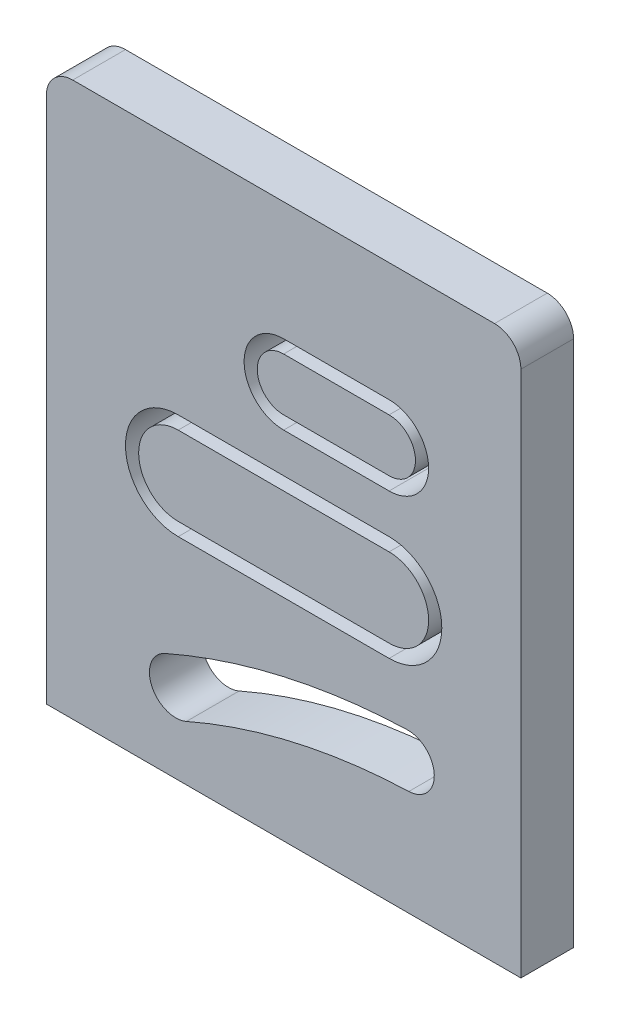
ISO-10303-21;
HEADER;
FILE_DESCRIPTION(('STEP AP214'),'2;1');
FILE_NAME('part.step','',(''),(''),'','','');
FILE_SCHEMA(('AUTOMOTIVE_DESIGN { 1 0 10303 214 1 1 1 1 }'));
ENDSEC;
DATA;
#1=APPLICATION_CONTEXT('core data for automotive mechanical design processes');
#2=APPLICATION_PROTOCOL_DEFINITION('international standard','automotive_design',2000,#1);
#3=PRODUCT_CONTEXT('',#1,'mechanical');
#4=PRODUCT('Part','Part','',(#3));
#5=PRODUCT_RELATED_PRODUCT_CATEGORY('part','',(#4));
#6=PRODUCT_DEFINITION_FORMATION('','',#4);
#7=PRODUCT_DEFINITION_CONTEXT('part definition',#1,'design');
#8=PRODUCT_DEFINITION('design','',#6,#7);
#9=PRODUCT_DEFINITION_SHAPE('','',#8);
#10=(LENGTH_UNIT() NAMED_UNIT(*) SI_UNIT(.MILLI.,.METRE.));
#11=(NAMED_UNIT(*) PLANE_ANGLE_UNIT() SI_UNIT($,.RADIAN.));
#12=(NAMED_UNIT(*) SI_UNIT($,.STERADIAN.) SOLID_ANGLE_UNIT());
#13=UNCERTAINTY_MEASURE_WITH_UNIT(LENGTH_MEASURE(1.E-05),#10,'distance_accuracy_value','');
#14=(GEOMETRIC_REPRESENTATION_CONTEXT(3) GLOBAL_UNCERTAINTY_ASSIGNED_CONTEXT((#13)) GLOBAL_UNIT_ASSIGNED_CONTEXT((#10,
#11,#12)) REPRESENTATION_CONTEXT('',''));
#15=CARTESIAN_POINT('',(0.,0.,0.));
#16=DIRECTION('',(0.,0.,1.));
#17=DIRECTION('',(1.,0.,0.));
#18=AXIS2_PLACEMENT_3D('',#15,#16,#17);
#19=CARTESIAN_POINT('',(0.,71.2101788482311,20.));
#20=DIRECTION('',(0.,1.,0.));
#21=DIRECTION('',(0.,0.,1.));
#22=AXIS2_PLACEMENT_3D('',#19,#20,#21);
#23=PLANE('',#22);
#24=DIRECTION('',(1.,0.,0.));
#25=VECTOR('',#24,1.);
#26=CARTESIAN_POINT('',(0.,71.2101788482311,0.));
#27=LINE('',#26,#25);
#28=CARTESIAN_POINT('',(-439.064282439332,71.2101788482311,0.));
#29=VERTEX_POINT('',#28);
#30=CARTESIAN_POINT('',(-359.064282439332,71.2101788482311,0.));
#31=VERTEX_POINT('',#30);
#32=EDGE_CURVE('E174',#29,#31,#27,.T.);
#33=ORIENTED_EDGE('',*,*,#32,.F.);
#34=DIRECTION('',(0.,0.,-1.));
#35=VECTOR('',#34,1.);
#36=CARTESIAN_POINT('',(-439.064282439332,71.2101788482311,20.));
#37=LINE('',#36,#35);
#38=CARTESIAN_POINT('',(-439.064282439332,71.2101788482311,20.));
#39=VERTEX_POINT('',#38);
#40=EDGE_CURVE('E13',#39,#29,#37,.T.);
#41=ORIENTED_EDGE('',*,*,#40,.F.);
#42=DIRECTION('',(1.,0.,0.));
#43=VECTOR('',#42,1.);
#44=CARTESIAN_POINT('',(0.,71.2101788482311,20.));
#45=LINE('',#44,#43);
#46=CARTESIAN_POINT('',(-359.064282439332,71.2101788482311,20.));
#47=VERTEX_POINT('',#46);
#48=EDGE_CURVE('E162',#39,#47,#45,.T.);
#49=ORIENTED_EDGE('',*,*,#48,.T.);
#50=DIRECTION('',(0.,0.,-1.));
#51=VECTOR('',#50,1.);
#52=CARTESIAN_POINT('',(-359.064282439332,71.2101788482311,20.));
#53=LINE('',#52,#51);
#54=EDGE_CURVE('E151',#47,#31,#53,.T.);
#55=ORIENTED_EDGE('',*,*,#54,.T.);
#56=EDGE_LOOP('',(#33,#41,#49,#55));
#57=FACE_BOUND('',#56,.T.);
#58=ADVANCED_FACE('F112',(#57),#23,.T.);
#59=CARTESIAN_POINT('',(-439.064282439332,56.2101788482311,20.));
#60=DIRECTION('',(0.,0.,-1.));
#61=DIRECTION('',(-1.,0.,0.));
#62=AXIS2_PLACEMENT_3D('',#59,#60,#61);
#63=CYLINDRICAL_SURFACE('',#62,15.);
#64=CARTESIAN_POINT('',(-439.064282439332,56.2101788482311,0.));
#65=DIRECTION('',(0.,0.,1.));
#66=DIRECTION('',(1.,0.,0.));
#67=AXIS2_PLACEMENT_3D('',#64,#65,#66);
#68=CIRCLE('',#67,15.);
#69=CARTESIAN_POINT('',(-439.064282439332,41.2101788482311,0.));
#70=VERTEX_POINT('',#69);
#71=EDGE_CURVE('E167',#29,#70,#68,.T.);
#72=ORIENTED_EDGE('',*,*,#71,.T.);
#73=DIRECTION('',(0.,0.,-1.));
#74=VECTOR('',#73,1.);
#75=CARTESIAN_POINT('',(-439.064282439332,41.2101788482311,20.));
#76=LINE('',#75,#74);
#77=CARTESIAN_POINT('',(-439.064282439332,41.2101788482311,20.));
#78=VERTEX_POINT('',#77);
#79=EDGE_CURVE('E120',#78,#70,#76,.T.);
#80=ORIENTED_EDGE('',*,*,#79,.F.);
#81=CARTESIAN_POINT('',(-439.064282439332,56.2101788482311,20.));
#82=DIRECTION('',(0.,0.,1.));
#83=DIRECTION('',(1.,0.,0.));
#84=AXIS2_PLACEMENT_3D('',#81,#82,#83);
#85=CIRCLE('',#84,15.);
#86=EDGE_CURVE('E157',#39,#78,#85,.T.);
#87=ORIENTED_EDGE('',*,*,#86,.F.);
#88=ORIENTED_EDGE('',*,*,#40,.T.);
#89=EDGE_LOOP('',(#72,#80,#87,#88));
#90=FACE_BOUND('',#89,.T.);
#91=ADVANCED_FACE('F165',(#90),#63,.T.);
#92=CARTESIAN_POINT('',(0.,41.2101788482311,20.));
#93=DIRECTION('',(0.,1.,0.));
#94=DIRECTION('',(0.,0.,1.));
#95=AXIS2_PLACEMENT_3D('',#92,#93,#94);
#96=PLANE('',#95);
#97=DIRECTION('',(1.,0.,0.));
#98=VECTOR('',#97,1.);
#99=CARTESIAN_POINT('',(0.,41.2101788482311,0.));
#100=LINE('',#99,#98);
#101=CARTESIAN_POINT('',(-359.064282439332,41.2101788482311,0.));
#102=VERTEX_POINT('',#101);
#103=EDGE_CURVE('E144',#70,#102,#100,.T.);
#104=ORIENTED_EDGE('',*,*,#103,.T.);
#105=DIRECTION('',(0.,0.,-1.));
#106=VECTOR('',#105,1.);
#107=CARTESIAN_POINT('',(-359.064282439332,41.2101788482311,20.));
#108=LINE('',#107,#106);
#109=CARTESIAN_POINT('',(-359.064282439332,41.2101788482311,20.));
#110=VERTEX_POINT('',#109);
#111=EDGE_CURVE('E168',#110,#102,#108,.T.);
#112=ORIENTED_EDGE('',*,*,#111,.F.);
#113=DIRECTION('',(1.,0.,0.));
#114=VECTOR('',#113,1.);
#115=CARTESIAN_POINT('',(0.,41.2101788482311,20.));
#116=LINE('',#115,#114);
#117=EDGE_CURVE('E161',#78,#110,#116,.T.);
#118=ORIENTED_EDGE('',*,*,#117,.F.);
#119=ORIENTED_EDGE('',*,*,#79,.T.);
#120=EDGE_LOOP('',(#104,#112,#118,#119));
#121=FACE_BOUND('',#120,.T.);
#122=ADVANCED_FACE('F169',(#121),#96,.F.);
#123=CARTESIAN_POINT('',(-359.064282439332,56.2101788482311,20.));
#124=DIRECTION('',(0.,0.,-1.));
#125=DIRECTION('',(-1.,0.,0.));
#126=AXIS2_PLACEMENT_3D('',#123,#124,#125);
#127=CYLINDRICAL_SURFACE('',#126,15.);
#128=CARTESIAN_POINT('',(-359.064282439332,56.2101788482311,0.));
#129=DIRECTION('',(0.,0.,1.));
#130=DIRECTION('',(1.,0.,0.));
#131=AXIS2_PLACEMENT_3D('',#128,#129,#130);
#132=CIRCLE('',#131,15.);
#133=EDGE_CURVE('E179',#102,#31,#132,.T.);
#134=ORIENTED_EDGE('',*,*,#133,.T.);
#135=ORIENTED_EDGE('',*,*,#54,.F.);
#136=CARTESIAN_POINT('',(-359.064282439332,56.2101788482311,20.));
#137=DIRECTION('',(0.,0.,1.));
#138=DIRECTION('',(1.,0.,0.));
#139=AXIS2_PLACEMENT_3D('',#136,#137,#138);
#140=CIRCLE('',#139,15.);
#141=EDGE_CURVE('E128',#110,#47,#140,.T.);
#142=ORIENTED_EDGE('',*,*,#141,.F.);
#143=ORIENTED_EDGE('',*,*,#111,.T.);
#144=EDGE_LOOP('',(#134,#135,#142,#143));
#145=FACE_BOUND('',#144,.T.);
#146=ADVANCED_FACE('F184',(#145),#127,.T.);
#147=CARTESIAN_POINT('',(0.,0.,20.));
#148=DIRECTION('',(0.,0.,1.));
#149=DIRECTION('',(1.,0.,0.));
#150=AXIS2_PLACEMENT_3D('',#147,#148,#149);
#151=PLANE('',#150);
#152=ORIENTED_EDGE('',*,*,#48,.F.);
#153=ORIENTED_EDGE('',*,*,#86,.T.);
#154=ORIENTED_EDGE('',*,*,#117,.T.);
#155=ORIENTED_EDGE('',*,*,#141,.T.);
#156=EDGE_LOOP('',(#152,#153,#154,#155));
#157=FACE_BOUND('',#156,.T.);
#158=ADVANCED_FACE('F159',(#157),#151,.T.);
#159=CARTESIAN_POINT('',(0.,0.,0.));
#160=DIRECTION('',(0.,0.,1.));
#161=DIRECTION('',(1.,0.,0.));
#162=AXIS2_PLACEMENT_3D('',#159,#160,#161);
#163=PLANE('',#162);
#164=ORIENTED_EDGE('',*,*,#32,.T.);
#165=ORIENTED_EDGE('',*,*,#133,.F.);
#166=ORIENTED_EDGE('',*,*,#103,.F.);
#167=ORIENTED_EDGE('',*,*,#71,.F.);
#168=EDGE_LOOP('',(#164,#165,#166,#167));
#169=FACE_BOUND('',#168,.T.);
#170=ADVANCED_FACE('F186',(#169),#163,.F.);
#171=CLOSED_SHELL('',(#58,#91,#122,#146,#158,#170));
#172=MANIFOLD_SOLID_BREP('B2',#171);
#173=CARTESIAN_POINT('',(0.,116.210178848231,20.));
#174=DIRECTION('',(0.,1.,0.));
#175=DIRECTION('',(0.,0.,1.));
#176=AXIS2_PLACEMENT_3D('',#173,#174,#175);
#177=PLANE('',#176);
#178=DIRECTION('',(1.,0.,0.));
#179=VECTOR('',#178,1.);
#180=CARTESIAN_POINT('',(0.,116.210178848231,0.));
#181=LINE('',#180,#179);
#182=CARTESIAN_POINT('',(-399.064282439332,116.210178848231,0.));
#183=VERTEX_POINT('',#182);
#184=CARTESIAN_POINT('',(-359.064282439332,116.210178848231,0.));
#185=VERTEX_POINT('',#184);
#186=EDGE_CURVE('E307',#183,#185,#181,.T.);
#187=ORIENTED_EDGE('',*,*,#186,.F.);
#188=DIRECTION('',(0.,0.,-1.));
#189=VECTOR('',#188,1.);
#190=CARTESIAN_POINT('',(-399.064282439332,116.210178848231,20.));
#191=LINE('',#190,#189);
#192=CARTESIAN_POINT('',(-399.064282439332,116.210178848231,20.));
#193=VERTEX_POINT('',#192);
#194=EDGE_CURVE('E110',#193,#183,#191,.T.);
#195=ORIENTED_EDGE('',*,*,#194,.F.);
#196=DIRECTION('',(1.,0.,0.));
#197=VECTOR('',#196,1.);
#198=CARTESIAN_POINT('',(0.,116.210178848231,20.));
#199=LINE('',#198,#197);
#200=CARTESIAN_POINT('',(-359.064282439332,116.210178848231,20.));
#201=VERTEX_POINT('',#200);
#202=EDGE_CURVE('E295',#193,#201,#199,.T.);
#203=ORIENTED_EDGE('',*,*,#202,.T.);
#204=DIRECTION('',(0.,0.,-1.));
#205=VECTOR('',#204,1.);
#206=CARTESIAN_POINT('',(-359.064282439332,116.210178848231,20.));
#207=LINE('',#206,#205);
#208=EDGE_CURVE('E284',#201,#185,#207,.T.);
#209=ORIENTED_EDGE('',*,*,#208,.T.);
#210=EDGE_LOOP('',(#187,#195,#203,#209));
#211=FACE_BOUND('',#210,.T.);
#212=ADVANCED_FACE('F245',(#211),#177,.T.);
#213=CARTESIAN_POINT('',(-399.064282439332,106.210178848231,20.));
#214=DIRECTION('',(0.,0.,-1.));
#215=DIRECTION('',(-1.,0.,0.));
#216=AXIS2_PLACEMENT_3D('',#213,#214,#215);
#217=CYLINDRICAL_SURFACE('',#216,9.99999999999999);
#218=CARTESIAN_POINT('',(-399.064282439332,106.210178848231,0.));
#219=DIRECTION('',(0.,0.,1.));
#220=DIRECTION('',(1.,0.,0.));
#221=AXIS2_PLACEMENT_3D('',#218,#219,#220);
#222=CIRCLE('',#221,9.99999999999999);
#223=CARTESIAN_POINT('',(-399.064282439332,96.2101788482311,0.));
#224=VERTEX_POINT('',#223);
#225=EDGE_CURVE('E300',#183,#224,#222,.T.);
#226=ORIENTED_EDGE('',*,*,#225,.T.);
#227=DIRECTION('',(0.,0.,-1.));
#228=VECTOR('',#227,1.);
#229=CARTESIAN_POINT('',(-399.064282439332,96.2101788482311,20.));
#230=LINE('',#229,#228);
#231=CARTESIAN_POINT('',(-399.064282439332,96.2101788482311,20.));
#232=VERTEX_POINT('',#231);
#233=EDGE_CURVE('E253',#232,#224,#230,.T.);
#234=ORIENTED_EDGE('',*,*,#233,.F.);
#235=CARTESIAN_POINT('',(-399.064282439332,106.210178848231,20.));
#236=DIRECTION('',(0.,0.,1.));
#237=DIRECTION('',(1.,0.,0.));
#238=AXIS2_PLACEMENT_3D('',#235,#236,#237);
#239=CIRCLE('',#238,9.99999999999999);
#240=EDGE_CURVE('E290',#193,#232,#239,.T.);
#241=ORIENTED_EDGE('',*,*,#240,.F.);
#242=ORIENTED_EDGE('',*,*,#194,.T.);
#243=EDGE_LOOP('',(#226,#234,#241,#242));
#244=FACE_BOUND('',#243,.T.);
#245=ADVANCED_FACE('F298',(#244),#217,.T.);
#246=CARTESIAN_POINT('',(0.,96.2101788482311,20.));
#247=DIRECTION('',(0.,1.,0.));
#248=DIRECTION('',(0.,0.,1.));
#249=AXIS2_PLACEMENT_3D('',#246,#247,#248);
#250=PLANE('',#249);
#251=DIRECTION('',(1.,0.,0.));
#252=VECTOR('',#251,1.);
#253=CARTESIAN_POINT('',(0.,96.2101788482311,0.));
#254=LINE('',#253,#252);
#255=CARTESIAN_POINT('',(-359.064282439332,96.2101788482311,0.));
#256=VERTEX_POINT('',#255);
#257=EDGE_CURVE('E277',#224,#256,#254,.T.);
#258=ORIENTED_EDGE('',*,*,#257,.T.);
#259=DIRECTION('',(0.,0.,-1.));
#260=VECTOR('',#259,1.);
#261=CARTESIAN_POINT('',(-359.064282439332,96.2101788482311,20.));
#262=LINE('',#261,#260);
#263=CARTESIAN_POINT('',(-359.064282439332,96.2101788482311,20.));
#264=VERTEX_POINT('',#263);
#265=EDGE_CURVE('E301',#264,#256,#262,.T.);
#266=ORIENTED_EDGE('',*,*,#265,.F.);
#267=DIRECTION('',(1.,0.,0.));
#268=VECTOR('',#267,1.);
#269=CARTESIAN_POINT('',(0.,96.2101788482311,20.));
#270=LINE('',#269,#268);
#271=EDGE_CURVE('E294',#232,#264,#270,.T.);
#272=ORIENTED_EDGE('',*,*,#271,.F.);
#273=ORIENTED_EDGE('',*,*,#233,.T.);
#274=EDGE_LOOP('',(#258,#266,#272,#273));
#275=FACE_BOUND('',#274,.T.);
#276=ADVANCED_FACE('F302',(#275),#250,.F.);
#277=CARTESIAN_POINT('',(-359.064282439332,106.210178848231,20.));
#278=DIRECTION('',(0.,0.,-1.));
#279=DIRECTION('',(-1.,0.,0.));
#280=AXIS2_PLACEMENT_3D('',#277,#278,#279);
#281=CYLINDRICAL_SURFACE('',#280,9.99999999999999);
#282=CARTESIAN_POINT('',(-359.064282439332,106.210178848231,0.));
#283=DIRECTION('',(0.,0.,1.));
#284=DIRECTION('',(1.,0.,0.));
#285=AXIS2_PLACEMENT_3D('',#282,#283,#284);
#286=CIRCLE('',#285,9.99999999999999);
#287=EDGE_CURVE('E312',#256,#185,#286,.T.);
#288=ORIENTED_EDGE('',*,*,#287,.T.);
#289=ORIENTED_EDGE('',*,*,#208,.F.);
#290=CARTESIAN_POINT('',(-359.064282439332,106.210178848231,20.));
#291=DIRECTION('',(0.,0.,1.));
#292=DIRECTION('',(1.,0.,0.));
#293=AXIS2_PLACEMENT_3D('',#290,#291,#292);
#294=CIRCLE('',#293,9.99999999999999);
#295=EDGE_CURVE('E261',#264,#201,#294,.T.);
#296=ORIENTED_EDGE('',*,*,#295,.F.);
#297=ORIENTED_EDGE('',*,*,#265,.T.);
#298=EDGE_LOOP('',(#288,#289,#296,#297));
#299=FACE_BOUND('',#298,.T.);
#300=ADVANCED_FACE('F317',(#299),#281,.T.);
#301=CARTESIAN_POINT('',(0.,0.,20.));
#302=DIRECTION('',(0.,0.,1.));
#303=DIRECTION('',(1.,0.,0.));
#304=AXIS2_PLACEMENT_3D('',#301,#302,#303);
#305=PLANE('',#304);
#306=ORIENTED_EDGE('',*,*,#202,.F.);
#307=ORIENTED_EDGE('',*,*,#240,.T.);
#308=ORIENTED_EDGE('',*,*,#271,.T.);
#309=ORIENTED_EDGE('',*,*,#295,.T.);
#310=EDGE_LOOP('',(#306,#307,#308,#309));
#311=FACE_BOUND('',#310,.T.);
#312=ADVANCED_FACE('F292',(#311),#305,.T.);
#313=CARTESIAN_POINT('',(0.,0.,0.));
#314=DIRECTION('',(0.,0.,1.));
#315=DIRECTION('',(1.,0.,0.));
#316=AXIS2_PLACEMENT_3D('',#313,#314,#315);
#317=PLANE('',#316);
#318=ORIENTED_EDGE('',*,*,#186,.T.);
#319=ORIENTED_EDGE('',*,*,#287,.F.);
#320=ORIENTED_EDGE('',*,*,#257,.F.);
#321=ORIENTED_EDGE('',*,*,#225,.F.);
#322=EDGE_LOOP('',(#318,#319,#320,#321));
#323=FACE_BOUND('',#322,.T.);
#324=ADVANCED_FACE('F319',(#323),#317,.F.);
#325=CLOSED_SHELL('',(#212,#245,#276,#300,#312,#324));
#326=MANIFOLD_SOLID_BREP('B7',#325);
#327=CARTESIAN_POINT('',(0.,166.210178848231,20.));
#328=DIRECTION('',(0.,1.,0.));
#329=DIRECTION('',(0.,0.,1.));
#330=AXIS2_PLACEMENT_3D('',#327,#328,#329);
#331=PLANE('',#330);
#332=DIRECTION('',(1.,0.,0.));
#333=VECTOR('',#332,1.);
#334=CARTESIAN_POINT('',(0.,166.210178848231,0.));
#335=LINE('',#334,#333);
#336=CARTESIAN_POINT('',(-479.064282439333,166.210178848231,0.));
#337=VERTEX_POINT('',#336);
#338=CARTESIAN_POINT('',(-319.064282439332,166.210178848231,0.));
#339=VERTEX_POINT('',#338);
#340=EDGE_CURVE('E582',#337,#339,#335,.T.);
#341=ORIENTED_EDGE('',*,*,#340,.F.);
#342=DIRECTION('',(0.,0.,-1.));
#343=VECTOR('',#342,1.);
#344=CARTESIAN_POINT('',(-479.064282439333,166.210178848231,20.));
#345=LINE('',#344,#343);
#346=CARTESIAN_POINT('',(-479.064282439333,166.210178848231,20.));
#347=VERTEX_POINT('',#346);
#348=EDGE_CURVE('E243',#347,#337,#345,.T.);
#349=ORIENTED_EDGE('',*,*,#348,.F.);
#350=DIRECTION('',(1.,0.,0.));
#351=VECTOR('',#350,1.);
#352=CARTESIAN_POINT('',(0.,166.210178848231,20.));
#353=LINE('',#352,#351);
#354=CARTESIAN_POINT('',(-319.064282439332,166.210178848231,20.));
#355=VERTEX_POINT('',#354);
#356=EDGE_CURVE('E704',#347,#355,#353,.T.);
#357=ORIENTED_EDGE('',*,*,#356,.T.);
#358=DIRECTION('',(0.,0.,-1.));
#359=VECTOR('',#358,1.);
#360=CARTESIAN_POINT('',(-319.064282439332,166.210178848231,20.));
#361=LINE('',#360,#359);
#362=EDGE_CURVE('E453',#355,#339,#361,.T.);
#363=ORIENTED_EDGE('',*,*,#362,.T.);
#364=EDGE_LOOP('',(#341,#349,#357,#363));
#365=FACE_BOUND('',#364,.T.);
#366=ADVANCED_FACE('F369',(#365),#331,.T.);
#367=CARTESIAN_POINT('',(-479.064282439333,156.210178848231,20.));
#368=DIRECTION('',(0.,0.,-1.));
#369=DIRECTION('',(-1.,0.,0.));
#370=AXIS2_PLACEMENT_3D('',#367,#368,#369);
#371=CYLINDRICAL_SURFACE('',#370,9.9999999999999);
#372=CARTESIAN_POINT('',(-479.064282439333,156.210178848231,0.));
#373=DIRECTION('',(0.,0.,1.));
#374=DIRECTION('',(1.,0.,0.));
#375=AXIS2_PLACEMENT_3D('',#372,#373,#374);
#376=CIRCLE('',#375,9.9999999999999);
#377=CARTESIAN_POINT('',(-489.064282439332,156.210178848231,0.));
#378=VERTEX_POINT('',#377);
#379=EDGE_CURVE('E586',#337,#378,#376,.T.);
#380=ORIENTED_EDGE('',*,*,#379,.T.);
#381=DIRECTION('',(0.,0.,-1.));
#382=VECTOR('',#381,1.);
#383=CARTESIAN_POINT('',(-489.064282439332,156.210178848231,20.));
#384=LINE('',#383,#382);
#385=CARTESIAN_POINT('',(-489.064282439332,156.210178848231,20.));
#386=VERTEX_POINT('',#385);
#387=EDGE_CURVE('E380',#386,#378,#384,.T.);
#388=ORIENTED_EDGE('',*,*,#387,.F.);
#389=CARTESIAN_POINT('',(-479.064282439333,156.210178848231,20.));
#390=DIRECTION('',(0.,0.,1.));
#391=DIRECTION('',(1.,0.,0.));
#392=AXIS2_PLACEMENT_3D('',#389,#390,#391);
#393=CIRCLE('',#392,9.9999999999999);
#394=EDGE_CURVE('E707',#347,#386,#393,.T.);
#395=ORIENTED_EDGE('',*,*,#394,.F.);
#396=ORIENTED_EDGE('',*,*,#348,.T.);
#397=EDGE_LOOP('',(#380,#388,#395,#396));
#398=FACE_BOUND('',#397,.T.);
#399=ADVANCED_FACE('F713',(#398),#371,.T.);
#400=CARTESIAN_POINT('',(-489.064282439332,0.,20.));
#401=DIRECTION('',(1.,0.,0.));
#402=DIRECTION('',(0.,0.,-1.));
#403=AXIS2_PLACEMENT_3D('',#400,#401,#402);
#404=PLANE('',#403);
#405=DIRECTION('',(0.,-1.,0.));
#406=VECTOR('',#405,1.);
#407=CARTESIAN_POINT('',(-489.064282439332,0.,0.));
#408=LINE('',#407,#406);
#409=CARTESIAN_POINT('',(-489.064282439332,-43.7898211517689,0.));
#410=VERTEX_POINT('',#409);
#411=EDGE_CURVE('E590',#378,#410,#408,.T.);
#412=ORIENTED_EDGE('',*,*,#411,.T.);
#413=DIRECTION('',(0.,0.,-1.));
#414=VECTOR('',#413,1.);
#415=CARTESIAN_POINT('',(-489.064282439332,-43.7898211517689,20.));
#416=LINE('',#415,#414);
#417=CARTESIAN_POINT('',(-489.064282439332,-43.7898211517689,20.));
#418=VERTEX_POINT('',#417);
#419=EDGE_CURVE('E524',#418,#410,#416,.T.);
#420=ORIENTED_EDGE('',*,*,#419,.F.);
#421=DIRECTION('',(0.,-1.,0.));
#422=VECTOR('',#421,1.);
#423=CARTESIAN_POINT('',(-489.064282439332,0.,20.));
#424=LINE('',#423,#422);
#425=EDGE_CURVE('E510',#386,#418,#424,.T.);
#426=ORIENTED_EDGE('',*,*,#425,.F.);
#427=ORIENTED_EDGE('',*,*,#387,.T.);
#428=EDGE_LOOP('',(#412,#420,#426,#427));
#429=FACE_BOUND('',#428,.T.);
#430=ADVANCED_FACE('F716',(#429),#404,.F.);
#431=CARTESIAN_POINT('',(0.,-43.7898211517689,20.));
#432=DIRECTION('',(0.,1.,0.));
#433=DIRECTION('',(0.,0.,1.));
#434=AXIS2_PLACEMENT_3D('',#431,#432,#433);
#435=PLANE('',#434);
#436=DIRECTION('',(1.,0.,0.));
#437=VECTOR('',#436,1.);
#438=CARTESIAN_POINT('',(0.,-43.7898211517689,0.));
#439=LINE('',#438,#437);
#440=CARTESIAN_POINT('',(-309.064282439332,-43.7898211517689,0.));
#441=VERTEX_POINT('',#440);
#442=EDGE_CURVE('E519',#410,#441,#439,.T.);
#443=ORIENTED_EDGE('',*,*,#442,.T.);
#444=DIRECTION('',(0.,0.,-1.));
#445=VECTOR('',#444,1.);
#446=CARTESIAN_POINT('',(-309.064282439332,-43.7898211517689,20.));
#447=LINE('',#446,#445);
#448=CARTESIAN_POINT('',(-309.064282439332,-43.7898211517689,20.));
#449=VERTEX_POINT('',#448);
#450=EDGE_CURVE('E517',#449,#441,#447,.T.);
#451=ORIENTED_EDGE('',*,*,#450,.F.);
#452=DIRECTION('',(1.,0.,0.));
#453=VECTOR('',#452,1.);
#454=CARTESIAN_POINT('',(0.,-43.7898211517689,20.));
#455=LINE('',#454,#453);
#456=EDGE_CURVE('E504',#418,#449,#455,.T.);
#457=ORIENTED_EDGE('',*,*,#456,.F.);
#458=ORIENTED_EDGE('',*,*,#419,.T.);
#459=EDGE_LOOP('',(#443,#451,#457,#458));
#460=FACE_BOUND('',#459,.T.);
#461=ADVANCED_FACE('F518',(#460),#435,.F.);
#462=CARTESIAN_POINT('',(-309.064282439332,0.,20.));
#463=DIRECTION('',(1.,0.,0.));
#464=DIRECTION('',(0.,0.,-1.));
#465=AXIS2_PLACEMENT_3D('',#462,#463,#464);
#466=PLANE('',#465);
#467=DIRECTION('',(0.,-1.,0.));
#468=VECTOR('',#467,1.);
#469=CARTESIAN_POINT('',(-309.064282439332,0.,0.));
#470=LINE('',#469,#468);
#471=CARTESIAN_POINT('',(-309.064282439332,156.210178848231,0.));
#472=VERTEX_POINT('',#471);
#473=EDGE_CURVE('E596',#472,#441,#470,.T.);
#474=ORIENTED_EDGE('',*,*,#473,.F.);
#475=DIRECTION('',(0.,0.,-1.));
#476=VECTOR('',#475,1.);
#477=CARTESIAN_POINT('',(-309.064282439332,156.210178848231,20.));
#478=LINE('',#477,#476);
#479=CARTESIAN_POINT('',(-309.064282439332,156.210178848231,20.));
#480=VERTEX_POINT('',#479);
#481=EDGE_CURVE('E446',#480,#472,#478,.T.);
#482=ORIENTED_EDGE('',*,*,#481,.F.);
#483=DIRECTION('',(0.,-1.,0.));
#484=VECTOR('',#483,1.);
#485=CARTESIAN_POINT('',(-309.064282439332,0.,20.));
#486=LINE('',#485,#484);
#487=EDGE_CURVE('E508',#480,#449,#486,.T.);
#488=ORIENTED_EDGE('',*,*,#487,.T.);
#489=ORIENTED_EDGE('',*,*,#450,.T.);
#490=EDGE_LOOP('',(#474,#482,#488,#489));
#491=FACE_BOUND('',#490,.T.);
#492=ADVANCED_FACE('F526',(#491),#466,.T.);
#493=CARTESIAN_POINT('',(-359.064282439332,106.210178848231,20.));
#494=DIRECTION('',(0.,0.,-1.));
#495=DIRECTION('',(-1.,0.,0.));
#496=AXIS2_PLACEMENT_3D('',#493,#494,#495);
#497=CYLINDRICAL_SURFACE('',#496,15.);
#498=CARTESIAN_POINT('',(-359.064282439332,106.210178848231,0.));
#499=DIRECTION('',(0.,0.,1.));
#500=DIRECTION('',(1.,0.,0.));
#501=AXIS2_PLACEMENT_3D('',#498,#499,#500);
#502=CIRCLE('',#501,15.);
#503=CARTESIAN_POINT('',(-359.064282439332,91.2101788482311,0.));
#504=VERTEX_POINT('',#503);
#505=CARTESIAN_POINT('',(-359.064282439332,121.210178848231,0.));
#506=VERTEX_POINT('',#505);
#507=EDGE_CURVE('E566',#504,#506,#502,.T.);
#508=ORIENTED_EDGE('',*,*,#507,.F.);
#509=DIRECTION('',(0.,0.,-1.));
#510=VECTOR('',#509,1.);
#511=CARTESIAN_POINT('',(-359.064282439332,91.2101788482311,20.));
#512=LINE('',#511,#510);
#513=CARTESIAN_POINT('',(-359.064282439332,91.2101788482311,20.));
#514=VERTEX_POINT('',#513);
#515=EDGE_CURVE('E605',#514,#504,#512,.T.);
#516=ORIENTED_EDGE('',*,*,#515,.F.);
#517=CARTESIAN_POINT('',(-359.064282439332,106.210178848231,20.));
#518=DIRECTION('',(0.,0.,1.));
#519=DIRECTION('',(1.,0.,0.));
#520=AXIS2_PLACEMENT_3D('',#517,#518,#519);
#521=CIRCLE('',#520,15.);
#522=CARTESIAN_POINT('',(-359.064282439332,121.210178848231,20.));
#523=VERTEX_POINT('',#522);
#524=EDGE_CURVE('E689',#514,#523,#521,.T.);
#525=ORIENTED_EDGE('',*,*,#524,.T.);
#526=DIRECTION('',(0.,0.,-1.));
#527=VECTOR('',#526,1.);
#528=CARTESIAN_POINT('',(-359.064282439332,121.210178848231,20.));
#529=LINE('',#528,#527);
#530=EDGE_CURVE('E613',#523,#506,#529,.T.);
#531=ORIENTED_EDGE('',*,*,#530,.T.);
#532=EDGE_LOOP('',(#508,#516,#525,#531));
#533=FACE_BOUND('',#532,.T.);
#534=ADVANCED_FACE('F740',(#533),#497,.F.);
#535=CARTESIAN_POINT('',(0.,91.2101788482313,20.));
#536=DIRECTION('',(0.,1.,0.));
#537=DIRECTION('',(-1.,0.,0.));
#538=AXIS2_PLACEMENT_3D('',#535,#536,#537);
#539=PLANE('',#538);
#540=DIRECTION('',(1.,0.,0.));
#541=VECTOR('',#540,1.);
#542=CARTESIAN_POINT('',(0.,91.2101788482313,0.));
#543=LINE('',#542,#541);
#544=CARTESIAN_POINT('',(-399.064282439332,91.2101788482311,0.));
#545=VERTEX_POINT('',#544);
#546=EDGE_CURVE('E570',#545,#504,#543,.T.);
#547=ORIENTED_EDGE('',*,*,#546,.F.);
#548=DIRECTION('',(0.,0.,-1.));
#549=VECTOR('',#548,1.);
#550=CARTESIAN_POINT('',(-399.064282439332,91.2101788482311,20.));
#551=LINE('',#550,#549);
#552=CARTESIAN_POINT('',(-399.064282439332,91.2101788482311,20.));
#553=VERTEX_POINT('',#552);
#554=EDGE_CURVE('E620',#553,#545,#551,.T.);
#555=ORIENTED_EDGE('',*,*,#554,.F.);
#556=DIRECTION('',(1.,0.,0.));
#557=VECTOR('',#556,1.);
#558=CARTESIAN_POINT('',(0.,91.2101788482313,20.));
#559=LINE('',#558,#557);
#560=EDGE_CURVE('E693',#553,#514,#559,.T.);
#561=ORIENTED_EDGE('',*,*,#560,.T.);
#562=ORIENTED_EDGE('',*,*,#515,.T.);
#563=EDGE_LOOP('',(#547,#555,#561,#562));
#564=FACE_BOUND('',#563,.T.);
#565=ADVANCED_FACE('F736',(#564),#539,.T.);
#566=CARTESIAN_POINT('',(-399.064282439332,106.210178848231,20.));
#567=DIRECTION('',(0.,0.,-1.));
#568=DIRECTION('',(-1.,0.,0.));
#569=AXIS2_PLACEMENT_3D('',#566,#567,#568);
#570=CYLINDRICAL_SURFACE('',#569,15.);
#571=CARTESIAN_POINT('',(-399.064282439332,106.210178848231,0.));
#572=DIRECTION('',(0.,0.,1.));
#573=DIRECTION('',(1.,0.,0.));
#574=AXIS2_PLACEMENT_3D('',#571,#572,#573);
#575=CIRCLE('',#574,15.);
#576=CARTESIAN_POINT('',(-399.064282439332,121.210178848231,0.));
#577=VERTEX_POINT('',#576);
#578=EDGE_CURVE('E574',#577,#545,#575,.T.);
#579=ORIENTED_EDGE('',*,*,#578,.F.);
#580=DIRECTION('',(0.,0.,-1.));
#581=VECTOR('',#580,1.);
#582=CARTESIAN_POINT('',(-399.064282439332,121.210178848231,20.));
#583=LINE('',#582,#581);
#584=CARTESIAN_POINT('',(-399.064282439332,121.210178848231,20.));
#585=VERTEX_POINT('',#584);
#586=EDGE_CURVE('E616',#585,#577,#583,.T.);
#587=ORIENTED_EDGE('',*,*,#586,.F.);
#588=CARTESIAN_POINT('',(-399.064282439332,106.210178848231,20.));
#589=DIRECTION('',(0.,0.,1.));
#590=DIRECTION('',(1.,0.,0.));
#591=AXIS2_PLACEMENT_3D('',#588,#589,#590);
#592=CIRCLE('',#591,15.);
#593=EDGE_CURVE('E697',#585,#553,#592,.T.);
#594=ORIENTED_EDGE('',*,*,#593,.T.);
#595=ORIENTED_EDGE('',*,*,#554,.T.);
#596=EDGE_LOOP('',(#579,#587,#594,#595));
#597=FACE_BOUND('',#596,.T.);
#598=ADVANCED_FACE('F732',(#597),#570,.F.);
#599=CARTESIAN_POINT('',(-359.064282439332,56.2101788482311,20.));
#600=DIRECTION('',(0.,0.,-1.));
#601=DIRECTION('',(-1.,0.,0.));
#602=AXIS2_PLACEMENT_3D('',#599,#600,#601);
#603=CYLINDRICAL_SURFACE('',#602,20.);
#604=CARTESIAN_POINT('',(-359.064282439332,56.2101788482311,0.));
#605=DIRECTION('',(0.,0.,1.));
#606=DIRECTION('',(1.,0.,0.));
#607=AXIS2_PLACEMENT_3D('',#604,#605,#606);
#608=CIRCLE('',#607,20.);
#609=CARTESIAN_POINT('',(-359.064282439332,36.2101788482311,0.));
#610=VERTEX_POINT('',#609);
#611=CARTESIAN_POINT('',(-359.064282439332,76.2101788482311,0.));
#612=VERTEX_POINT('',#611);
#613=EDGE_CURVE('E550',#610,#612,#608,.T.);
#614=ORIENTED_EDGE('',*,*,#613,.F.);
#615=DIRECTION('',(0.,0.,-1.));
#616=VECTOR('',#615,1.);
#617=CARTESIAN_POINT('',(-359.064282439332,36.2101788482311,20.));
#618=LINE('',#617,#616);
#619=CARTESIAN_POINT('',(-359.064282439332,36.2101788482311,20.));
#620=VERTEX_POINT('',#619);
#621=EDGE_CURVE('E617',#620,#610,#618,.T.);
#622=ORIENTED_EDGE('',*,*,#621,.F.);
#623=CARTESIAN_POINT('',(-359.064282439332,56.2101788482311,20.));
#624=DIRECTION('',(0.,0.,1.));
#625=DIRECTION('',(1.,0.,0.));
#626=AXIS2_PLACEMENT_3D('',#623,#624,#625);
#627=CIRCLE('',#626,20.);
#628=CARTESIAN_POINT('',(-359.064282439332,76.2101788482311,20.));
#629=VERTEX_POINT('',#628);
#630=EDGE_CURVE('E666',#620,#629,#627,.T.);
#631=ORIENTED_EDGE('',*,*,#630,.T.);
#632=DIRECTION('',(0.,0.,-1.));
#633=VECTOR('',#632,1.);
#634=CARTESIAN_POINT('',(-359.064282439332,76.2101788482311,20.));
#635=LINE('',#634,#633);
#636=EDGE_CURVE('E625',#629,#612,#635,.T.);
#637=ORIENTED_EDGE('',*,*,#636,.T.);
#638=EDGE_LOOP('',(#614,#622,#631,#637));
#639=FACE_BOUND('',#638,.T.);
#640=ADVANCED_FACE('F735',(#639),#603,.F.);
#641=CARTESIAN_POINT('',(0.,36.2101788482311,20.));
#642=DIRECTION('',(0.,1.,0.));
#643=DIRECTION('',(0.,0.,1.));
#644=AXIS2_PLACEMENT_3D('',#641,#642,#643);
#645=PLANE('',#644);
#646=DIRECTION('',(1.,0.,0.));
#647=VECTOR('',#646,1.);
#648=CARTESIAN_POINT('',(0.,36.2101788482311,0.));
#649=LINE('',#648,#647);
#650=CARTESIAN_POINT('',(-439.064282439332,36.2101788482311,0.));
#651=VERTEX_POINT('',#650);
#652=EDGE_CURVE('E554',#651,#610,#649,.T.);
#653=ORIENTED_EDGE('',*,*,#652,.F.);
#654=DIRECTION('',(0.,0.,-1.));
#655=VECTOR('',#654,1.);
#656=CARTESIAN_POINT('',(-439.064282439332,36.2101788482311,20.));
#657=LINE('',#656,#655);
#658=CARTESIAN_POINT('',(-439.064282439332,36.2101788482311,20.));
#659=VERTEX_POINT('',#658);
#660=EDGE_CURVE('E631',#659,#651,#657,.T.);
#661=ORIENTED_EDGE('',*,*,#660,.F.);
#662=DIRECTION('',(1.,0.,0.));
#663=VECTOR('',#662,1.);
#664=CARTESIAN_POINT('',(0.,36.2101788482311,20.));
#665=LINE('',#664,#663);
#666=EDGE_CURVE('E678',#659,#620,#665,.T.);
#667=ORIENTED_EDGE('',*,*,#666,.T.);
#668=ORIENTED_EDGE('',*,*,#621,.T.);
#669=EDGE_LOOP('',(#653,#661,#667,#668));
#670=FACE_BOUND('',#669,.T.);
#671=ADVANCED_FACE('F751',(#670),#645,.T.);
#672=CARTESIAN_POINT('',(-439.064282439332,56.2101788482311,20.));
#673=DIRECTION('',(0.,0.,-1.));
#674=DIRECTION('',(-1.,0.,0.));
#675=AXIS2_PLACEMENT_3D('',#672,#673,#674);
#676=CYLINDRICAL_SURFACE('',#675,20.);
#677=CARTESIAN_POINT('',(-439.064282439332,56.2101788482311,0.));
#678=DIRECTION('',(0.,0.,1.));
#679=DIRECTION('',(1.,0.,0.));
#680=AXIS2_PLACEMENT_3D('',#677,#678,#679);
#681=CIRCLE('',#680,20.);
#682=CARTESIAN_POINT('',(-439.064282439332,76.2101788482311,0.));
#683=VERTEX_POINT('',#682);
#684=EDGE_CURVE('E558',#683,#651,#681,.T.);
#685=ORIENTED_EDGE('',*,*,#684,.F.);
#686=DIRECTION('',(0.,0.,-1.));
#687=VECTOR('',#686,1.);
#688=CARTESIAN_POINT('',(-439.064282439332,76.2101788482311,20.));
#689=LINE('',#688,#687);
#690=CARTESIAN_POINT('',(-439.064282439332,76.2101788482311,20.));
#691=VERTEX_POINT('',#690);
#692=EDGE_CURVE('E628',#691,#683,#689,.T.);
#693=ORIENTED_EDGE('',*,*,#692,.F.);
#694=CARTESIAN_POINT('',(-439.064282439332,56.2101788482311,20.));
#695=DIRECTION('',(0.,0.,1.));
#696=DIRECTION('',(1.,0.,0.));
#697=AXIS2_PLACEMENT_3D('',#694,#695,#696);
#698=CIRCLE('',#697,20.);
#699=EDGE_CURVE('E682',#691,#659,#698,.T.);
#700=ORIENTED_EDGE('',*,*,#699,.T.);
#701=ORIENTED_EDGE('',*,*,#660,.T.);
#702=EDGE_LOOP('',(#685,#693,#700,#701));
#703=FACE_BOUND('',#702,.T.);
#704=ADVANCED_FACE('F748',(#703),#676,.F.);
#705=CARTESIAN_POINT('',(-439.974282439332,-13.7898211517689,20.));
#706=DIRECTION('',(0.,0.,-1.));
#707=DIRECTION('',(-1.,0.,0.));
#708=AXIS2_PLACEMENT_3D('',#705,#706,#707);
#709=CYLINDRICAL_SURFACE('',#708,10.);
#710=CARTESIAN_POINT('',(-439.974282439332,-13.7898211517689,0.));
#711=DIRECTION('',(0.,0.,1.));
#712=DIRECTION('',(1.,0.,0.));
#713=AXIS2_PLACEMENT_3D('',#710,#711,#712);
#714=CIRCLE('',#713,10.);
#715=CARTESIAN_POINT('',(-444.000712397748,-4.63625016608368,0.));
#716=VERTEX_POINT('',#715);
#717=CARTESIAN_POINT('',(-435.947852480917,-22.943392137454,0.));
#718=VERTEX_POINT('',#717);
#719=EDGE_CURVE('E534',#716,#718,#714,.T.);
#720=ORIENTED_EDGE('',*,*,#719,.F.);
#721=DIRECTION('',(0.,0.,-1.));
#722=VECTOR('',#721,1.);
#723=CARTESIAN_POINT('',(-444.000712397748,-4.63625016608368,20.));
#724=LINE('',#723,#722);
#725=CARTESIAN_POINT('',(-444.000712397748,-4.63625016608368,20.));
#726=VERTEX_POINT('',#725);
#727=EDGE_CURVE('E373',#726,#716,#724,.T.);
#728=ORIENTED_EDGE('',*,*,#727,.F.);
#729=CARTESIAN_POINT('',(-439.974282439332,-13.7898211517689,20.));
#730=DIRECTION('',(0.,0.,1.));
#731=DIRECTION('',(1.,0.,0.));
#732=AXIS2_PLACEMENT_3D('',#729,#730,#731);
#733=CIRCLE('',#732,10.);
#734=CARTESIAN_POINT('',(-435.947852480917,-22.943392137454,20.));
#735=VERTEX_POINT('',#734);
#736=EDGE_CURVE('E602',#726,#735,#733,.T.);
#737=ORIENTED_EDGE('',*,*,#736,.T.);
#738=DIRECTION('',(0.,0.,-1.));
#739=VECTOR('',#738,1.);
#740=CARTESIAN_POINT('',(-435.947852480917,-22.943392137454,20.));
#741=LINE('',#740,#739);
#742=EDGE_CURVE('E530',#735,#718,#741,.T.);
#743=ORIENTED_EDGE('',*,*,#742,.T.);
#744=EDGE_LOOP('',(#720,#728,#737,#743));
#745=FACE_BOUND('',#744,.T.);
#746=ADVANCED_FACE('F371',(#745),#709,.F.);
#747=CARTESIAN_POINT('',(-344.245460682487,-231.416993206735,20.));
#748=DIRECTION('',(0.,0.,-1.));
#749=DIRECTION('',(-1.,0.,0.));
#750=AXIS2_PLACEMENT_3D('',#747,#748,#749);
#751=CYLINDRICAL_SURFACE('',#750,247.751116362459);
#752=CARTESIAN_POINT('',(-344.245460682487,-231.416993206735,0.));
#753=DIRECTION('',(0.,0.,1.));
#754=DIRECTION('',(1.,0.,0.));
#755=AXIS2_PLACEMENT_3D('',#752,#753,#754);
#756=CIRCLE('',#755,247.751116362459);
#757=CARTESIAN_POINT('',(-352.244282439332,16.204965652626,0.));
#758=VERTEX_POINT('',#757);
#759=EDGE_CURVE('E538',#758,#716,#756,.T.);
#760=ORIENTED_EDGE('',*,*,#759,.F.);
#761=DIRECTION('',(0.,0.,-1.));
#762=VECTOR('',#761,1.);
#763=CARTESIAN_POINT('',(-352.244282439332,16.204965652626,20.));
#764=LINE('',#763,#762);
#765=CARTESIAN_POINT('',(-352.244282439332,16.204965652626,20.));
#766=VERTEX_POINT('',#765);
#767=EDGE_CURVE('E640',#766,#758,#764,.T.);
#768=ORIENTED_EDGE('',*,*,#767,.F.);
#769=CARTESIAN_POINT('',(-344.245460682487,-231.416993206735,20.));
#770=DIRECTION('',(0.,0.,1.));
#771=DIRECTION('',(1.,0.,0.));
#772=AXIS2_PLACEMENT_3D('',#769,#770,#771);
#773=CIRCLE('',#772,247.751116362459);
#774=EDGE_CURVE('E651',#766,#726,#773,.T.);
#775=ORIENTED_EDGE('',*,*,#774,.T.);
#776=ORIENTED_EDGE('',*,*,#727,.T.);
#777=EDGE_LOOP('',(#760,#768,#775,#776));
#778=FACE_BOUND('',#777,.T.);
#779=ADVANCED_FACE('F649',(#778),#751,.F.);
#780=CARTESIAN_POINT('',(-351.921425296475,6.21017884823114,20.));
#781=DIRECTION('',(0.,0.,-1.));
#782=DIRECTION('',(-1.,0.,0.));
#783=AXIS2_PLACEMENT_3D('',#780,#781,#782);
#784=CYLINDRICAL_SURFACE('',#783,10.);
#785=CARTESIAN_POINT('',(-351.921425296475,6.21017884823114,0.));
#786=DIRECTION('',(0.,0.,1.));
#787=DIRECTION('',(1.,0.,0.));
#788=AXIS2_PLACEMENT_3D('',#785,#786,#787);
#789=CIRCLE('',#788,10.);
#790=CARTESIAN_POINT('',(-351.598568153618,-3.78460795616378,0.));
#791=VERTEX_POINT('',#790);
#792=EDGE_CURVE('E542',#791,#758,#789,.T.);
#793=ORIENTED_EDGE('',*,*,#792,.F.);
#794=DIRECTION('',(0.,0.,-1.));
#795=VECTOR('',#794,1.);
#796=CARTESIAN_POINT('',(-351.598568153618,-3.78460795616378,20.));
#797=LINE('',#796,#795);
#798=CARTESIAN_POINT('',(-351.598568153618,-3.78460795616378,20.));
#799=VERTEX_POINT('',#798);
#800=EDGE_CURVE('E638',#799,#791,#797,.T.);
#801=ORIENTED_EDGE('',*,*,#800,.F.);
#802=CARTESIAN_POINT('',(-351.921425296475,6.21017884823114,20.));
#803=DIRECTION('',(0.,0.,1.));
#804=DIRECTION('',(1.,0.,0.));
#805=AXIS2_PLACEMENT_3D('',#802,#803,#804);
#806=CIRCLE('',#805,10.);
#807=EDGE_CURVE('E660',#799,#766,#806,.T.);
#808=ORIENTED_EDGE('',*,*,#807,.T.);
#809=ORIENTED_EDGE('',*,*,#767,.T.);
#810=EDGE_LOOP('',(#793,#801,#808,#809));
#811=FACE_BOUND('',#810,.T.);
#812=ADVANCED_FACE('F657',(#811),#784,.F.);
#813=CARTESIAN_POINT('',(0.,121.210178848231,20.));
#814=DIRECTION('',(0.,1.,0.));
#815=DIRECTION('',(-1.,0.,0.));
#816=AXIS2_PLACEMENT_3D('',#813,#814,#815);
#817=PLANE('',#816);
#818=DIRECTION('',(1.,0.,0.));
#819=VECTOR('',#818,1.);
#820=CARTESIAN_POINT('',(0.,121.210178848231,0.));
#821=LINE('',#820,#819);
#822=EDGE_CURVE('E578',#577,#506,#821,.T.);
#823=ORIENTED_EDGE('',*,*,#822,.T.);
#824=ORIENTED_EDGE('',*,*,#530,.F.);
#825=DIRECTION('',(1.,0.,0.));
#826=VECTOR('',#825,1.);
#827=CARTESIAN_POINT('',(0.,121.210178848231,20.));
#828=LINE('',#827,#826);
#829=EDGE_CURVE('E701',#585,#523,#828,.T.);
#830=ORIENTED_EDGE('',*,*,#829,.F.);
#831=ORIENTED_EDGE('',*,*,#586,.T.);
#832=EDGE_LOOP('',(#823,#824,#830,#831));
#833=FACE_BOUND('',#832,.T.);
#834=ADVANCED_FACE('F727',(#833),#817,.F.);
#835=CARTESIAN_POINT('',(0.,76.2101788482311,20.));
#836=DIRECTION('',(0.,1.,0.));
#837=DIRECTION('',(0.,0.,1.));
#838=AXIS2_PLACEMENT_3D('',#835,#836,#837);
#839=PLANE('',#838);
#840=DIRECTION('',(1.,0.,0.));
#841=VECTOR('',#840,1.);
#842=CARTESIAN_POINT('',(0.,76.2101788482311,0.));
#843=LINE('',#842,#841);
#844=EDGE_CURVE('E562',#683,#612,#843,.T.);
#845=ORIENTED_EDGE('',*,*,#844,.T.);
#846=ORIENTED_EDGE('',*,*,#636,.F.);
#847=DIRECTION('',(1.,0.,0.));
#848=VECTOR('',#847,1.);
#849=CARTESIAN_POINT('',(0.,76.2101788482311,20.));
#850=LINE('',#849,#848);
#851=EDGE_CURVE('E686',#691,#629,#850,.T.);
#852=ORIENTED_EDGE('',*,*,#851,.F.);
#853=ORIENTED_EDGE('',*,*,#692,.T.);
#854=EDGE_LOOP('',(#845,#846,#852,#853));
#855=FACE_BOUND('',#854,.T.);
#856=ADVANCED_FACE('F730',(#855),#839,.F.);
#857=CARTESIAN_POINT('',(-344.245460682487,-231.416993206735,20.));
#858=DIRECTION('',(0.,0.,-1.));
#859=DIRECTION('',(-1.,0.,0.));
#860=AXIS2_PLACEMENT_3D('',#857,#858,#859);
#861=CYLINDRICAL_SURFACE('',#860,227.751116362459);
#862=CARTESIAN_POINT('',(-344.245460682487,-231.416993206735,0.));
#863=DIRECTION('',(0.,0.,1.));
#864=DIRECTION('',(1.,0.,0.));
#865=AXIS2_PLACEMENT_3D('',#862,#863,#864);
#866=CIRCLE('',#865,227.751116362459);
#867=EDGE_CURVE('E546',#791,#718,#866,.T.);
#868=ORIENTED_EDGE('',*,*,#867,.T.);
#869=ORIENTED_EDGE('',*,*,#742,.F.);
#870=CARTESIAN_POINT('',(-344.245460682487,-231.416993206735,20.));
#871=DIRECTION('',(0.,0.,1.));
#872=DIRECTION('',(1.,0.,0.));
#873=AXIS2_PLACEMENT_3D('',#870,#871,#872);
#874=CIRCLE('',#873,227.751116362459);
#875=EDGE_CURVE('E662',#799,#735,#874,.T.);
#876=ORIENTED_EDGE('',*,*,#875,.F.);
#877=ORIENTED_EDGE('',*,*,#800,.T.);
#878=EDGE_LOOP('',(#868,#869,#876,#877));
#879=FACE_BOUND('',#878,.T.);
#880=ADVANCED_FACE('F663',(#879),#861,.T.);
#881=CARTESIAN_POINT('',(-319.064282439332,156.210178848231,20.));
#882=DIRECTION('',(0.,0.,-1.));
#883=DIRECTION('',(-1.,0.,0.));
#884=AXIS2_PLACEMENT_3D('',#881,#882,#883);
#885=CYLINDRICAL_SURFACE('',#884,9.9999999999999);
#886=CARTESIAN_POINT('',(-319.064282439332,156.210178848231,0.));
#887=DIRECTION('',(0.,0.,1.));
#888=DIRECTION('',(1.,0.,0.));
#889=AXIS2_PLACEMENT_3D('',#886,#887,#888);
#890=CIRCLE('',#889,9.9999999999999);
#891=EDGE_CURVE('E599',#472,#339,#890,.T.);
#892=ORIENTED_EDGE('',*,*,#891,.T.);
#893=ORIENTED_EDGE('',*,*,#362,.F.);
#894=CARTESIAN_POINT('',(-319.064282439332,156.210178848231,20.));
#895=DIRECTION('',(0.,0.,1.));
#896=DIRECTION('',(1.,0.,0.));
#897=AXIS2_PLACEMENT_3D('',#894,#895,#896);
#898=CIRCLE('',#897,9.9999999999999);
#899=EDGE_CURVE('E389',#480,#355,#898,.T.);
#900=ORIENTED_EDGE('',*,*,#899,.F.);
#901=ORIENTED_EDGE('',*,*,#481,.T.);
#902=EDGE_LOOP('',(#892,#893,#900,#901));
#903=FACE_BOUND('',#902,.T.);
#904=ADVANCED_FACE('F718',(#903),#885,.T.);
#905=CARTESIAN_POINT('',(0.,0.,20.));
#906=DIRECTION('',(0.,0.,1.));
#907=DIRECTION('',(1.,0.,0.));
#908=AXIS2_PLACEMENT_3D('',#905,#906,#907);
#909=PLANE('',#908);
#910=ORIENTED_EDGE('',*,*,#736,.F.);
#911=ORIENTED_EDGE('',*,*,#774,.F.);
#912=ORIENTED_EDGE('',*,*,#807,.F.);
#913=ORIENTED_EDGE('',*,*,#875,.T.);
#914=EDGE_LOOP('',(#910,#911,#912,#913));
#915=FACE_BOUND('',#914,.T.);
#916=ORIENTED_EDGE('',*,*,#630,.F.);
#917=ORIENTED_EDGE('',*,*,#666,.F.);
#918=ORIENTED_EDGE('',*,*,#699,.F.);
#919=ORIENTED_EDGE('',*,*,#851,.T.);
#920=EDGE_LOOP('',(#916,#917,#918,#919));
#921=FACE_BOUND('',#920,.T.);
#922=ORIENTED_EDGE('',*,*,#524,.F.);
#923=ORIENTED_EDGE('',*,*,#560,.F.);
#924=ORIENTED_EDGE('',*,*,#593,.F.);
#925=ORIENTED_EDGE('',*,*,#829,.T.);
#926=EDGE_LOOP('',(#922,#923,#924,#925));
#927=FACE_BOUND('',#926,.T.);
#928=ORIENTED_EDGE('',*,*,#356,.F.);
#929=ORIENTED_EDGE('',*,*,#394,.T.);
#930=ORIENTED_EDGE('',*,*,#425,.T.);
#931=ORIENTED_EDGE('',*,*,#456,.T.);
#932=ORIENTED_EDGE('',*,*,#487,.F.);
#933=ORIENTED_EDGE('',*,*,#899,.T.);
#934=EDGE_LOOP('',(#928,#929,#930,#931,#932,#933));
#935=FACE_BOUND('',#934,.T.);
#936=ADVANCED_FACE('F506',(#915,#921,#927,#935),#909,.T.);
#937=CARTESIAN_POINT('',(0.,0.,0.));
#938=DIRECTION('',(0.,0.,1.));
#939=DIRECTION('',(1.,0.,0.));
#940=AXIS2_PLACEMENT_3D('',#937,#938,#939);
#941=PLANE('',#940);
#942=ORIENTED_EDGE('',*,*,#719,.T.);
#943=ORIENTED_EDGE('',*,*,#867,.F.);
#944=ORIENTED_EDGE('',*,*,#792,.T.);
#945=ORIENTED_EDGE('',*,*,#759,.T.);
#946=EDGE_LOOP('',(#942,#943,#944,#945));
#947=FACE_BOUND('',#946,.T.);
#948=ORIENTED_EDGE('',*,*,#613,.T.);
#949=ORIENTED_EDGE('',*,*,#844,.F.);
#950=ORIENTED_EDGE('',*,*,#684,.T.);
#951=ORIENTED_EDGE('',*,*,#652,.T.);
#952=EDGE_LOOP('',(#948,#949,#950,#951));
#953=FACE_BOUND('',#952,.T.);
#954=ORIENTED_EDGE('',*,*,#507,.T.);
#955=ORIENTED_EDGE('',*,*,#822,.F.);
#956=ORIENTED_EDGE('',*,*,#578,.T.);
#957=ORIENTED_EDGE('',*,*,#546,.T.);
#958=EDGE_LOOP('',(#954,#955,#956,#957));
#959=FACE_BOUND('',#958,.T.);
#960=ORIENTED_EDGE('',*,*,#340,.T.);
#961=ORIENTED_EDGE('',*,*,#891,.F.);
#962=ORIENTED_EDGE('',*,*,#473,.T.);
#963=ORIENTED_EDGE('',*,*,#442,.F.);
#964=ORIENTED_EDGE('',*,*,#411,.F.);
#965=ORIENTED_EDGE('',*,*,#379,.F.);
#966=EDGE_LOOP('',(#960,#961,#962,#963,#964,#965));
#967=FACE_BOUND('',#966,.T.);
#968=ADVANCED_FACE('F655',(#947,#953,#959,#967),#941,.F.);
#969=CLOSED_SHELL('',(#366,#399,#430,#461,#492,#534,#565,#598,#640,#671,#704,#746,#779,#812,
#834,#856,#880,#904,#936,#968));
#970=MANIFOLD_SOLID_BREP('B104',#969);
#971=ADVANCED_BREP_SHAPE_REPRESENTATION('',(#18,#172,#326,#970),#14);
#972=SHAPE_DEFINITION_REPRESENTATION(#9,#971);
ENDSEC;
END-ISO-10303-21;
